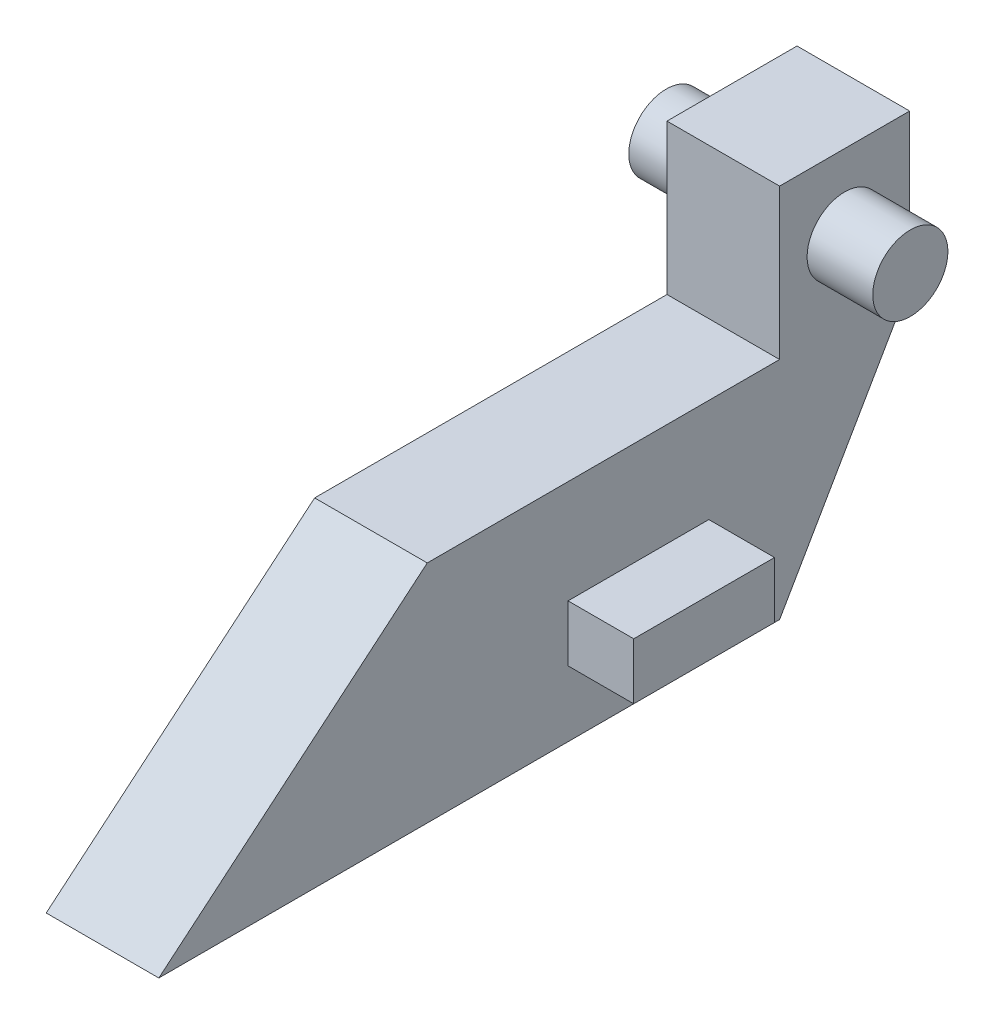
ISO-10303-21;
HEADER;
FILE_DESCRIPTION(('STEP AP214'),'2;1');
FILE_NAME('part.step','',(''),(''),'','','');
FILE_SCHEMA(('AUTOMOTIVE_DESIGN { 1 0 10303 214 1 1 1 1 }'));
ENDSEC;
DATA;
#1=APPLICATION_CONTEXT('core data for automotive mechanical design processes');
#2=APPLICATION_PROTOCOL_DEFINITION('international standard','automotive_design',2000,#1);
#3=PRODUCT_CONTEXT('',#1,'mechanical');
#4=PRODUCT('Part','Part','',(#3));
#5=PRODUCT_RELATED_PRODUCT_CATEGORY('part','',(#4));
#6=PRODUCT_DEFINITION_FORMATION('','',#4);
#7=PRODUCT_DEFINITION_CONTEXT('part definition',#1,'design');
#8=PRODUCT_DEFINITION('design','',#6,#7);
#9=PRODUCT_DEFINITION_SHAPE('','',#8);
#10=(LENGTH_UNIT() NAMED_UNIT(*) SI_UNIT(.MILLI.,.METRE.));
#11=(NAMED_UNIT(*) PLANE_ANGLE_UNIT() SI_UNIT($,.RADIAN.));
#12=(NAMED_UNIT(*) SI_UNIT($,.STERADIAN.) SOLID_ANGLE_UNIT());
#13=UNCERTAINTY_MEASURE_WITH_UNIT(LENGTH_MEASURE(1.E-05),#10,'distance_accuracy_value','');
#14=(GEOMETRIC_REPRESENTATION_CONTEXT(3) GLOBAL_UNCERTAINTY_ASSIGNED_CONTEXT((#13)) GLOBAL_UNIT_ASSIGNED_CONTEXT((#10,
#11,#12)) REPRESENTATION_CONTEXT('',''));
#15=CARTESIAN_POINT('',(0.,0.,0.));
#16=DIRECTION('',(0.,0.,1.));
#17=DIRECTION('',(1.,0.,0.));
#18=AXIS2_PLACEMENT_3D('',#15,#16,#17);
#19=CARTESIAN_POINT('',(6.,24.,-80.));
#20=DIRECTION('',(1.,0.,0.));
#21=DIRECTION('',(0.,1.,0.));
#22=AXIS2_PLACEMENT_3D('',#19,#20,#21);
#23=PLANE('',#22);
#24=CARTESIAN_POINT('',(6.,32.,-73.0717967697245));
#25=DIRECTION('',(1.,0.,0.));
#26=DIRECTION('',(0.,1.,0.));
#27=AXIS2_PLACEMENT_3D('',#24,#25,#26);
#28=CIRCLE('',#27,4.00000000000001);
#29=CARTESIAN_POINT('',(6.,32.,-69.0717967697245));
#30=VERTEX_POINT('',#29);
#31=EDGE_CURVE('E273',#30,#30,#28,.F.);
#32=ORIENTED_EDGE('',*,*,#31,.T.);
#33=EDGE_LOOP('',(#32));
#34=FACE_BOUND('',#33,.T.);
#35=DIRECTION('',(0.,0.642787609686535,-0.766044443118982));
#36=VECTOR('',#35,1.);
#37=CARTESIAN_POINT('',(6.,0.,0.));
#38=LINE('',#37,#36);
#39=CARTESIAN_POINT('',(6.,0.,0.));
#40=VERTEX_POINT('',#39);
#41=CARTESIAN_POINT('',(6.,24.,-28.6020862222614));
#42=VERTEX_POINT('',#41);
#43=EDGE_CURVE('E235',#40,#42,#38,.T.);
#44=ORIENTED_EDGE('',*,*,#43,.F.);
#45=DIRECTION('',(0.,0.,1.));
#46=VECTOR('',#45,1.);
#47=CARTESIAN_POINT('',(6.,0.,-80.));
#48=LINE('',#47,#46);
#49=CARTESIAN_POINT('',(6.,0.,-66.1435935394491));
#50=VERTEX_POINT('',#49);
#51=EDGE_CURVE('E256',#50,#40,#48,.T.);
#52=ORIENTED_EDGE('',*,*,#51,.F.);
#53=DIRECTION('',(0.,-0.86602540378444,0.499999999999998));
#54=VECTOR('',#53,1.);
#55=CARTESIAN_POINT('',(6.,-28.6410161513775,-49.6076951545869));
#56=LINE('',#55,#54);
#57=CARTESIAN_POINT('',(6.,24.,-80.));
#58=VERTEX_POINT('',#57);
#59=EDGE_CURVE('E234',#58,#50,#56,.T.);
#60=ORIENTED_EDGE('',*,*,#59,.F.);
#61=DIRECTION('',(0.,-1.,0.));
#62=VECTOR('',#61,1.);
#63=CARTESIAN_POINT('',(6.,40.,-80.));
#64=LINE('',#63,#62);
#65=CARTESIAN_POINT('',(6.,40.,-80.));
#66=VERTEX_POINT('',#65);
#67=EDGE_CURVE('E173',#66,#58,#64,.T.);
#68=ORIENTED_EDGE('',*,*,#67,.F.);
#69=DIRECTION('',(0.,0.,-1.));
#70=VECTOR('',#69,1.);
#71=CARTESIAN_POINT('',(6.,40.,-80.));
#72=LINE('',#71,#70);
#73=CARTESIAN_POINT('',(6.,40.,-66.1435935394491));
#74=VERTEX_POINT('',#73);
#75=EDGE_CURVE('E158',#74,#66,#72,.T.);
#76=ORIENTED_EDGE('',*,*,#75,.F.);
#77=DIRECTION('',(0.,-1.,0.));
#78=VECTOR('',#77,1.);
#79=CARTESIAN_POINT('',(6.,40.,-66.1435935394491));
#80=LINE('',#79,#78);
#81=CARTESIAN_POINT('',(6.,24.,-66.1435935394491));
#82=VERTEX_POINT('',#81);
#83=EDGE_CURVE('E155',#74,#82,#80,.T.);
#84=ORIENTED_EDGE('',*,*,#83,.T.);
#85=DIRECTION('',(0.,0.,1.));
#86=VECTOR('',#85,1.);
#87=CARTESIAN_POINT('',(6.,24.,-80.));
#88=LINE('',#87,#86);
#89=EDGE_CURVE('E50',#82,#42,#88,.T.);
#90=ORIENTED_EDGE('',*,*,#89,.T.);
#91=EDGE_LOOP('',(#44,#52,#60,#68,#76,#84,#90));
#92=FACE_BOUND('',#91,.T.);
#93=DIRECTION('',(0.,0.,-1.));
#94=VECTOR('',#93,1.);
#95=CARTESIAN_POINT('',(6.,7.,-43.6020862222614));
#96=LINE('',#95,#94);
#97=CARTESIAN_POINT('',(6.,7.,-43.6020862222614));
#98=VERTEX_POINT('',#97);
#99=CARTESIAN_POINT('',(6.,7.,-58.6020862222614));
#100=VERTEX_POINT('',#99);
#101=EDGE_CURVE('E219',#98,#100,#96,.T.);
#102=ORIENTED_EDGE('',*,*,#101,.F.);
#103=DIRECTION('',(0.,-1.,0.));
#104=VECTOR('',#103,1.);
#105=CARTESIAN_POINT('',(6.,13.,-43.6020862222614));
#106=LINE('',#105,#104);
#107=CARTESIAN_POINT('',(6.,13.,-43.6020862222614));
#108=VERTEX_POINT('',#107);
#109=EDGE_CURVE('E205',#108,#98,#106,.T.);
#110=ORIENTED_EDGE('',*,*,#109,.F.);
#111=DIRECTION('',(0.,0.,1.));
#112=VECTOR('',#111,1.);
#113=CARTESIAN_POINT('',(6.,13.,-43.6020862222614));
#114=LINE('',#113,#112);
#115=CARTESIAN_POINT('',(6.,13.,-58.6020862222614));
#116=VERTEX_POINT('',#115);
#117=EDGE_CURVE('E210',#116,#108,#114,.T.);
#118=ORIENTED_EDGE('',*,*,#117,.F.);
#119=DIRECTION('',(0.,1.,0.));
#120=VECTOR('',#119,1.);
#121=CARTESIAN_POINT('',(6.,13.,-58.6020862222614));
#122=LINE('',#121,#120);
#123=EDGE_CURVE('E221',#100,#116,#122,.T.);
#124=ORIENTED_EDGE('',*,*,#123,.F.);
#125=EDGE_LOOP('',(#102,#110,#118,#124));
#126=FACE_BOUND('',#125,.T.);
#127=ADVANCED_FACE('F41',(#34,#92,#126),#23,.T.);
#128=CARTESIAN_POINT('',(-6.,24.,-80.));
#129=DIRECTION('',(-1.,0.,0.));
#130=DIRECTION('',(0.,-1.,0.));
#131=AXIS2_PLACEMENT_3D('',#128,#129,#130);
#132=PLANE('',#131);
#133=CARTESIAN_POINT('',(-6.,32.,-73.0717967697245));
#134=DIRECTION('',(-1.,0.,0.));
#135=DIRECTION('',(0.,-1.,0.));
#136=AXIS2_PLACEMENT_3D('',#133,#134,#135);
#137=CIRCLE('',#136,4.00000000000001);
#138=CARTESIAN_POINT('',(-6.,32.,-69.0717967697245));
#139=VERTEX_POINT('',#138);
#140=EDGE_CURVE('E45',#139,#139,#137,.F.);
#141=ORIENTED_EDGE('',*,*,#140,.T.);
#142=EDGE_LOOP('',(#141));
#143=FACE_BOUND('',#142,.T.);
#144=DIRECTION('',(0.,-1.,0.));
#145=VECTOR('',#144,1.);
#146=CARTESIAN_POINT('',(-6.,13.,-43.6020862222614));
#147=LINE('',#146,#145);
#148=CARTESIAN_POINT('',(-6.,13.,-43.6020862222614));
#149=VERTEX_POINT('',#148);
#150=CARTESIAN_POINT('',(-6.,7.,-43.6020862222614));
#151=VERTEX_POINT('',#150);
#152=EDGE_CURVE('E170',#149,#151,#147,.T.);
#153=ORIENTED_EDGE('',*,*,#152,.T.);
#154=DIRECTION('',(0.,0.,-1.));
#155=VECTOR('',#154,1.);
#156=CARTESIAN_POINT('',(-6.,7.,-43.6020862222614));
#157=LINE('',#156,#155);
#158=CARTESIAN_POINT('',(-6.,7.,-58.6020862222614));
#159=VERTEX_POINT('',#158);
#160=EDGE_CURVE('E181',#151,#159,#157,.T.);
#161=ORIENTED_EDGE('',*,*,#160,.T.);
#162=DIRECTION('',(0.,1.,0.));
#163=VECTOR('',#162,1.);
#164=CARTESIAN_POINT('',(-6.,13.,-58.6020862222614));
#165=LINE('',#164,#163);
#166=CARTESIAN_POINT('',(-6.,13.,-58.6020862222614));
#167=VERTEX_POINT('',#166);
#168=EDGE_CURVE('E192',#159,#167,#165,.T.);
#169=ORIENTED_EDGE('',*,*,#168,.T.);
#170=DIRECTION('',(0.,0.,1.));
#171=VECTOR('',#170,1.);
#172=CARTESIAN_POINT('',(-6.,13.,-43.6020862222614));
#173=LINE('',#172,#171);
#174=EDGE_CURVE('E65',#167,#149,#173,.T.);
#175=ORIENTED_EDGE('',*,*,#174,.T.);
#176=EDGE_LOOP('',(#153,#161,#169,#175));
#177=FACE_BOUND('',#176,.T.);
#178=DIRECTION('',(0.,-0.642787609686535,0.766044443118982));
#179=VECTOR('',#178,1.);
#180=CARTESIAN_POINT('',(-6.00000000000001,49.308531988485,-58.7636201428241));
#181=LINE('',#180,#179);
#182=CARTESIAN_POINT('',(-6.00000000000002,24.,-28.6020862222614));
#183=VERTEX_POINT('',#182);
#184=CARTESIAN_POINT('',(-6.,0.,0.));
#185=VERTEX_POINT('',#184);
#186=EDGE_CURVE('E242',#183,#185,#181,.T.);
#187=ORIENTED_EDGE('',*,*,#186,.F.);
#188=DIRECTION('',(0.,0.,1.));
#189=VECTOR('',#188,1.);
#190=CARTESIAN_POINT('',(-6.,24.,-80.));
#191=LINE('',#190,#189);
#192=CARTESIAN_POINT('',(-6.,24.,-66.1435935394491));
#193=VERTEX_POINT('',#192);
#194=EDGE_CURVE('E11',#193,#183,#191,.T.);
#195=ORIENTED_EDGE('',*,*,#194,.F.);
#196=DIRECTION('',(0.,-1.,0.));
#197=VECTOR('',#196,1.);
#198=CARTESIAN_POINT('',(-6.,40.,-66.1435935394491));
#199=LINE('',#198,#197);
#200=CARTESIAN_POINT('',(-6.,40.,-66.1435935394491));
#201=VERTEX_POINT('',#200);
#202=EDGE_CURVE('E153',#201,#193,#199,.T.);
#203=ORIENTED_EDGE('',*,*,#202,.F.);
#204=DIRECTION('',(0.,0.,1.));
#205=VECTOR('',#204,1.);
#206=CARTESIAN_POINT('',(-6.,40.,-80.));
#207=LINE('',#206,#205);
#208=CARTESIAN_POINT('',(-6.,40.,-80.));
#209=VERTEX_POINT('',#208);
#210=EDGE_CURVE('E159',#209,#201,#207,.T.);
#211=ORIENTED_EDGE('',*,*,#210,.F.);
#212=DIRECTION('',(0.,-1.,0.));
#213=VECTOR('',#212,1.);
#214=CARTESIAN_POINT('',(-6.,40.,-80.));
#215=LINE('',#214,#213);
#216=CARTESIAN_POINT('',(-6.,24.,-80.));
#217=VERTEX_POINT('',#216);
#218=EDGE_CURVE('E280',#209,#217,#215,.T.);
#219=ORIENTED_EDGE('',*,*,#218,.T.);
#220=DIRECTION('',(0.,0.86602540378444,-0.499999999999998));
#221=VECTOR('',#220,1.);
#222=CARTESIAN_POINT('',(-6.,24.,-80.));
#223=LINE('',#222,#221);
#224=CARTESIAN_POINT('',(-6.00000000000001,0.,-66.1435935394491));
#225=VERTEX_POINT('',#224);
#226=EDGE_CURVE('E247',#225,#217,#223,.T.);
#227=ORIENTED_EDGE('',*,*,#226,.F.);
#228=DIRECTION('',(0.,0.,1.));
#229=VECTOR('',#228,1.);
#230=CARTESIAN_POINT('',(-6.,0.,-80.));
#231=LINE('',#230,#229);
#232=EDGE_CURVE('E253',#225,#185,#231,.T.);
#233=ORIENTED_EDGE('',*,*,#232,.T.);
#234=EDGE_LOOP('',(#187,#195,#203,#211,#219,#227,#233));
#235=FACE_BOUND('',#234,.T.);
#236=ADVANCED_FACE('F43',(#143,#177,#235),#132,.T.);
#237=CARTESIAN_POINT('',(-6.,24.,-80.));
#238=DIRECTION('',(0.,1.,0.));
#239=DIRECTION('',(0.,0.,1.));
#240=AXIS2_PLACEMENT_3D('',#237,#238,#239);
#241=PLANE('',#240);
#242=DIRECTION('',(1.,0.,0.));
#243=VECTOR('',#242,1.);
#244=CARTESIAN_POINT('',(-6.,24.,-66.1435935394491));
#245=LINE('',#244,#243);
#246=EDGE_CURVE('E57',#193,#82,#245,.T.);
#247=ORIENTED_EDGE('',*,*,#246,.F.);
#248=ORIENTED_EDGE('',*,*,#194,.T.);
#249=DIRECTION('',(1.,0.,0.));
#250=VECTOR('',#249,1.);
#251=CARTESIAN_POINT('',(-46.,24.,-28.6020862222614));
#252=LINE('',#251,#250);
#253=EDGE_CURVE('E238',#183,#42,#252,.T.);
#254=ORIENTED_EDGE('',*,*,#253,.T.);
#255=ORIENTED_EDGE('',*,*,#89,.F.);
#256=EDGE_LOOP('',(#247,#248,#254,#255));
#257=FACE_BOUND('',#256,.T.);
#258=ADVANCED_FACE('F272',(#257),#241,.T.);
#259=CARTESIAN_POINT('',(-6.,0.,-80.));
#260=DIRECTION('',(0.,-1.,0.));
#261=DIRECTION('',(0.,0.,-1.));
#262=AXIS2_PLACEMENT_3D('',#259,#260,#261);
#263=PLANE('',#262);
#264=DIRECTION('',(1.,0.,0.));
#265=VECTOR('',#264,1.);
#266=CARTESIAN_POINT('',(-46.,0.,-66.1435935394491));
#267=LINE('',#266,#265);
#268=EDGE_CURVE('E239',#225,#50,#267,.T.);
#269=ORIENTED_EDGE('',*,*,#268,.T.);
#270=ORIENTED_EDGE('',*,*,#51,.T.);
#271=DIRECTION('',(1.,0.,0.));
#272=VECTOR('',#271,1.);
#273=CARTESIAN_POINT('',(-6.,0.,0.));
#274=LINE('',#273,#272);
#275=EDGE_CURVE('E249',#185,#40,#274,.T.);
#276=ORIENTED_EDGE('',*,*,#275,.F.);
#277=ORIENTED_EDGE('',*,*,#232,.F.);
#278=EDGE_LOOP('',(#269,#270,#276,#277));
#279=FACE_BOUND('',#278,.T.);
#280=ADVANCED_FACE('F263',(#279),#263,.T.);
#281=CARTESIAN_POINT('',(-46.,0.,0.));
#282=DIRECTION('',(0.,-0.766044443118982,-0.642787609686535));
#283=DIRECTION('',(0.,0.642787609686535,-0.766044443118982));
#284=AXIS2_PLACEMENT_3D('',#281,#282,#283);
#285=PLANE('',#284);
#286=ORIENTED_EDGE('',*,*,#186,.T.);
#287=ORIENTED_EDGE('',*,*,#275,.T.);
#288=ORIENTED_EDGE('',*,*,#43,.T.);
#289=ORIENTED_EDGE('',*,*,#253,.F.);
#290=EDGE_LOOP('',(#286,#287,#288,#289));
#291=FACE_BOUND('',#290,.T.);
#292=ADVANCED_FACE('F267',(#291),#285,.F.);
#293=CARTESIAN_POINT('',(-46.,-28.6410161513775,-49.6076951545869));
#294=DIRECTION('',(0.,0.499999999999998,0.86602540378444));
#295=DIRECTION('',(0.,-0.86602540378444,0.499999999999998));
#296=AXIS2_PLACEMENT_3D('',#293,#294,#295);
#297=PLANE('',#296);
#298=ORIENTED_EDGE('',*,*,#226,.T.);
#299=DIRECTION('',(-1.,0.,0.));
#300=VECTOR('',#299,1.);
#301=CARTESIAN_POINT('',(-6.,24.,-80.));
#302=LINE('',#301,#300);
#303=EDGE_CURVE('E250',#58,#217,#302,.T.);
#304=ORIENTED_EDGE('',*,*,#303,.F.);
#305=ORIENTED_EDGE('',*,*,#59,.T.);
#306=ORIENTED_EDGE('',*,*,#268,.F.);
#307=EDGE_LOOP('',(#298,#304,#305,#306));
#308=FACE_BOUND('',#307,.T.);
#309=ADVANCED_FACE('F286',(#308),#297,.F.);
#310=CARTESIAN_POINT('',(13.,13.,-43.6020862222614));
#311=DIRECTION('',(0.,0.,-1.));
#312=DIRECTION('',(-1.,0.,0.));
#313=AXIS2_PLACEMENT_3D('',#310,#311,#312);
#314=PLANE('',#313);
#315=ORIENTED_EDGE('',*,*,#109,.T.);
#316=DIRECTION('',(-1.,0.,0.));
#317=VECTOR('',#316,1.);
#318=CARTESIAN_POINT('',(13.,7.,-43.6020862222614));
#319=LINE('',#318,#317);
#320=CARTESIAN_POINT('',(13.,7.,-43.6020862222614));
#321=VERTEX_POINT('',#320);
#322=EDGE_CURVE('E232',#321,#98,#319,.T.);
#323=ORIENTED_EDGE('',*,*,#322,.F.);
#324=DIRECTION('',(0.,-1.,0.));
#325=VECTOR('',#324,1.);
#326=CARTESIAN_POINT('',(13.,13.,-43.6020862222614));
#327=LINE('',#326,#325);
#328=CARTESIAN_POINT('',(13.,13.,-43.6020862222614));
#329=VERTEX_POINT('',#328);
#330=EDGE_CURVE('E206',#329,#321,#327,.T.);
#331=ORIENTED_EDGE('',*,*,#330,.F.);
#332=DIRECTION('',(-1.,0.,0.));
#333=VECTOR('',#332,1.);
#334=CARTESIAN_POINT('',(13.,13.,-43.6020862222614));
#335=LINE('',#334,#333);
#336=EDGE_CURVE('E216',#329,#108,#335,.T.);
#337=ORIENTED_EDGE('',*,*,#336,.T.);
#338=EDGE_LOOP('',(#315,#323,#331,#337));
#339=FACE_BOUND('',#338,.T.);
#340=ADVANCED_FACE('F288',(#339),#314,.F.);
#341=CARTESIAN_POINT('',(13.,7.,-43.6020862222614));
#342=DIRECTION('',(0.,1.,0.));
#343=DIRECTION('',(-1.,0.,0.));
#344=AXIS2_PLACEMENT_3D('',#341,#342,#343);
#345=PLANE('',#344);
#346=ORIENTED_EDGE('',*,*,#101,.T.);
#347=DIRECTION('',(-1.,0.,0.));
#348=VECTOR('',#347,1.);
#349=CARTESIAN_POINT('',(13.,7.,-58.6020862222614));
#350=LINE('',#349,#348);
#351=CARTESIAN_POINT('',(13.,7.,-58.6020862222614));
#352=VERTEX_POINT('',#351);
#353=EDGE_CURVE('E229',#352,#100,#350,.T.);
#354=ORIENTED_EDGE('',*,*,#353,.F.);
#355=DIRECTION('',(0.,0.,-1.));
#356=VECTOR('',#355,1.);
#357=CARTESIAN_POINT('',(13.,7.,-43.6020862222614));
#358=LINE('',#357,#356);
#359=EDGE_CURVE('E209',#321,#352,#358,.T.);
#360=ORIENTED_EDGE('',*,*,#359,.F.);
#361=ORIENTED_EDGE('',*,*,#322,.T.);
#362=EDGE_LOOP('',(#346,#354,#360,#361));
#363=FACE_BOUND('',#362,.T.);
#364=ADVANCED_FACE('F295',(#363),#345,.F.);
#365=CARTESIAN_POINT('',(13.,13.,-58.6020862222614));
#366=DIRECTION('',(0.,0.,1.));
#367=DIRECTION('',(1.,0.,0.));
#368=AXIS2_PLACEMENT_3D('',#365,#366,#367);
#369=PLANE('',#368);
#370=ORIENTED_EDGE('',*,*,#123,.T.);
#371=DIRECTION('',(-1.,0.,0.));
#372=VECTOR('',#371,1.);
#373=CARTESIAN_POINT('',(13.,13.,-58.6020862222614));
#374=LINE('',#373,#372);
#375=CARTESIAN_POINT('',(13.,13.,-58.6020862222614));
#376=VERTEX_POINT('',#375);
#377=EDGE_CURVE('E227',#376,#116,#374,.T.);
#378=ORIENTED_EDGE('',*,*,#377,.F.);
#379=DIRECTION('',(0.,1.,0.));
#380=VECTOR('',#379,1.);
#381=CARTESIAN_POINT('',(13.,13.,-58.6020862222614));
#382=LINE('',#381,#380);
#383=EDGE_CURVE('E212',#352,#376,#382,.T.);
#384=ORIENTED_EDGE('',*,*,#383,.F.);
#385=ORIENTED_EDGE('',*,*,#353,.T.);
#386=EDGE_LOOP('',(#370,#378,#384,#385));
#387=FACE_BOUND('',#386,.T.);
#388=ADVANCED_FACE('F377',(#387),#369,.F.);
#389=CARTESIAN_POINT('',(13.,13.,-43.6020862222614));
#390=DIRECTION('',(0.,-1.,0.));
#391=DIRECTION('',(1.,0.,0.));
#392=AXIS2_PLACEMENT_3D('',#389,#390,#391);
#393=PLANE('',#392);
#394=ORIENTED_EDGE('',*,*,#117,.T.);
#395=ORIENTED_EDGE('',*,*,#336,.F.);
#396=DIRECTION('',(0.,0.,1.));
#397=VECTOR('',#396,1.);
#398=CARTESIAN_POINT('',(13.,13.,-43.6020862222614));
#399=LINE('',#398,#397);
#400=EDGE_CURVE('E214',#376,#329,#399,.T.);
#401=ORIENTED_EDGE('',*,*,#400,.F.);
#402=ORIENTED_EDGE('',*,*,#377,.T.);
#403=EDGE_LOOP('',(#394,#395,#401,#402));
#404=FACE_BOUND('',#403,.T.);
#405=ADVANCED_FACE('F368',(#404),#393,.F.);
#406=CARTESIAN_POINT('',(13.,0.,0.));
#407=DIRECTION('',(1.,0.,0.));
#408=DIRECTION('',(0.,1.,0.));
#409=AXIS2_PLACEMENT_3D('',#406,#407,#408);
#410=PLANE('',#409);
#411=ORIENTED_EDGE('',*,*,#330,.T.);
#412=ORIENTED_EDGE('',*,*,#359,.T.);
#413=ORIENTED_EDGE('',*,*,#383,.T.);
#414=ORIENTED_EDGE('',*,*,#400,.T.);
#415=EDGE_LOOP('',(#411,#412,#413,#414));
#416=FACE_BOUND('',#415,.T.);
#417=ADVANCED_FACE('F359',(#416),#410,.T.);
#418=CARTESIAN_POINT('',(-13.,13.,-43.6020862222614));
#419=DIRECTION('',(0.,0.,1.));
#420=DIRECTION('',(1.,0.,0.));
#421=AXIS2_PLACEMENT_3D('',#418,#419,#420);
#422=PLANE('',#421);
#423=ORIENTED_EDGE('',*,*,#152,.F.);
#424=DIRECTION('',(1.,0.,0.));
#425=VECTOR('',#424,1.);
#426=CARTESIAN_POINT('',(-13.,13.,-43.6020862222614));
#427=LINE('',#426,#425);
#428=CARTESIAN_POINT('',(-13.,13.,-43.6020862222614));
#429=VERTEX_POINT('',#428);
#430=EDGE_CURVE('E203',#429,#149,#427,.T.);
#431=ORIENTED_EDGE('',*,*,#430,.F.);
#432=DIRECTION('',(0.,-1.,0.));
#433=VECTOR('',#432,1.);
#434=CARTESIAN_POINT('',(-13.,13.,-43.6020862222614));
#435=LINE('',#434,#433);
#436=CARTESIAN_POINT('',(-13.,7.,-43.6020862222614));
#437=VERTEX_POINT('',#436);
#438=EDGE_CURVE('E177',#429,#437,#435,.T.);
#439=ORIENTED_EDGE('',*,*,#438,.T.);
#440=DIRECTION('',(1.,0.,0.));
#441=VECTOR('',#440,1.);
#442=CARTESIAN_POINT('',(-13.,7.,-43.6020862222614));
#443=LINE('',#442,#441);
#444=EDGE_CURVE('E189',#437,#151,#443,.T.);
#445=ORIENTED_EDGE('',*,*,#444,.T.);
#446=EDGE_LOOP('',(#423,#431,#439,#445));
#447=FACE_BOUND('',#446,.T.);
#448=ADVANCED_FACE('F350',(#447),#422,.T.);
#449=CARTESIAN_POINT('',(-13.,13.,-43.6020862222614));
#450=DIRECTION('',(0.,1.,0.));
#451=DIRECTION('',(-1.,0.,0.));
#452=AXIS2_PLACEMENT_3D('',#449,#450,#451);
#453=PLANE('',#452);
#454=ORIENTED_EDGE('',*,*,#174,.F.);
#455=DIRECTION('',(1.,0.,0.));
#456=VECTOR('',#455,1.);
#457=CARTESIAN_POINT('',(-13.,13.,-58.6020862222614));
#458=LINE('',#457,#456);
#459=CARTESIAN_POINT('',(-13.,13.,-58.6020862222614));
#460=VERTEX_POINT('',#459);
#461=EDGE_CURVE('E200',#460,#167,#458,.T.);
#462=ORIENTED_EDGE('',*,*,#461,.F.);
#463=DIRECTION('',(0.,0.,1.));
#464=VECTOR('',#463,1.);
#465=CARTESIAN_POINT('',(-13.,13.,-43.6020862222614));
#466=LINE('',#465,#464);
#467=EDGE_CURVE('E180',#460,#429,#466,.T.);
#468=ORIENTED_EDGE('',*,*,#467,.T.);
#469=ORIENTED_EDGE('',*,*,#430,.T.);
#470=EDGE_LOOP('',(#454,#462,#468,#469));
#471=FACE_BOUND('',#470,.T.);
#472=ADVANCED_FACE('F341',(#471),#453,.T.);
#473=CARTESIAN_POINT('',(-13.,13.,-58.6020862222614));
#474=DIRECTION('',(0.,0.,-1.));
#475=DIRECTION('',(-1.,0.,0.));
#476=AXIS2_PLACEMENT_3D('',#473,#474,#475);
#477=PLANE('',#476);
#478=ORIENTED_EDGE('',*,*,#168,.F.);
#479=DIRECTION('',(1.,0.,0.));
#480=VECTOR('',#479,1.);
#481=CARTESIAN_POINT('',(-13.,7.,-58.6020862222614));
#482=LINE('',#481,#480);
#483=CARTESIAN_POINT('',(-13.,7.,-58.6020862222614));
#484=VERTEX_POINT('',#483);
#485=EDGE_CURVE('E197',#484,#159,#482,.T.);
#486=ORIENTED_EDGE('',*,*,#485,.F.);
#487=DIRECTION('',(0.,1.,0.));
#488=VECTOR('',#487,1.);
#489=CARTESIAN_POINT('',(-13.,13.,-58.6020862222614));
#490=LINE('',#489,#488);
#491=EDGE_CURVE('E184',#484,#460,#490,.T.);
#492=ORIENTED_EDGE('',*,*,#491,.T.);
#493=ORIENTED_EDGE('',*,*,#461,.T.);
#494=EDGE_LOOP('',(#478,#486,#492,#493));
#495=FACE_BOUND('',#494,.T.);
#496=ADVANCED_FACE('F332',(#495),#477,.T.);
#497=CARTESIAN_POINT('',(-13.,7.,-43.6020862222614));
#498=DIRECTION('',(0.,-1.,0.));
#499=DIRECTION('',(1.,0.,0.));
#500=AXIS2_PLACEMENT_3D('',#497,#498,#499);
#501=PLANE('',#500);
#502=ORIENTED_EDGE('',*,*,#160,.F.);
#503=ORIENTED_EDGE('',*,*,#444,.F.);
#504=DIRECTION('',(0.,0.,-1.));
#505=VECTOR('',#504,1.);
#506=CARTESIAN_POINT('',(-13.,7.,-43.6020862222614));
#507=LINE('',#506,#505);
#508=EDGE_CURVE('E187',#437,#484,#507,.T.);
#509=ORIENTED_EDGE('',*,*,#508,.T.);
#510=ORIENTED_EDGE('',*,*,#485,.T.);
#511=EDGE_LOOP('',(#502,#503,#509,#510));
#512=FACE_BOUND('',#511,.T.);
#513=ADVANCED_FACE('F323',(#512),#501,.T.);
#514=CARTESIAN_POINT('',(-13.,0.,0.));
#515=DIRECTION('',(-1.,0.,0.));
#516=DIRECTION('',(0.,1.,0.));
#517=AXIS2_PLACEMENT_3D('',#514,#515,#516);
#518=PLANE('',#517);
#519=ORIENTED_EDGE('',*,*,#438,.F.);
#520=ORIENTED_EDGE('',*,*,#467,.F.);
#521=ORIENTED_EDGE('',*,*,#491,.F.);
#522=ORIENTED_EDGE('',*,*,#508,.F.);
#523=EDGE_LOOP('',(#519,#520,#521,#522));
#524=FACE_BOUND('',#523,.T.);
#525=ADVANCED_FACE('F319',(#524),#518,.T.);
#526=CARTESIAN_POINT('',(-6.,40.,-66.1435935394491));
#527=DIRECTION('',(0.,0.,-1.));
#528=DIRECTION('',(-1.,0.,0.));
#529=AXIS2_PLACEMENT_3D('',#526,#527,#528);
#530=PLANE('',#529);
#531=ORIENTED_EDGE('',*,*,#246,.T.);
#532=ORIENTED_EDGE('',*,*,#83,.F.);
#533=DIRECTION('',(1.,0.,0.));
#534=VECTOR('',#533,1.);
#535=CARTESIAN_POINT('',(-6.,40.,-66.1435935394491));
#536=LINE('',#535,#534);
#537=EDGE_CURVE('E149',#201,#74,#536,.T.);
#538=ORIENTED_EDGE('',*,*,#537,.F.);
#539=ORIENTED_EDGE('',*,*,#202,.T.);
#540=EDGE_LOOP('',(#531,#532,#538,#539));
#541=FACE_BOUND('',#540,.T.);
#542=ADVANCED_FACE('F151',(#541),#530,.F.);
#543=CARTESIAN_POINT('',(-6.,40.,-80.));
#544=DIRECTION('',(0.,0.,1.));
#545=DIRECTION('',(1.,0.,0.));
#546=AXIS2_PLACEMENT_3D('',#543,#544,#545);
#547=PLANE('',#546);
#548=ORIENTED_EDGE('',*,*,#303,.T.);
#549=ORIENTED_EDGE('',*,*,#218,.F.);
#550=DIRECTION('',(-1.,0.,0.));
#551=VECTOR('',#550,1.);
#552=CARTESIAN_POINT('',(-6.,40.,-80.));
#553=LINE('',#552,#551);
#554=EDGE_CURVE('E164',#66,#209,#553,.T.);
#555=ORIENTED_EDGE('',*,*,#554,.F.);
#556=ORIENTED_EDGE('',*,*,#67,.T.);
#557=EDGE_LOOP('',(#548,#549,#555,#556));
#558=FACE_BOUND('',#557,.T.);
#559=ADVANCED_FACE('F284',(#558),#547,.F.);
#560=CARTESIAN_POINT('',(0.,40.,0.));
#561=DIRECTION('',(0.,1.,0.));
#562=DIRECTION('',(0.,0.,1.));
#563=AXIS2_PLACEMENT_3D('',#560,#561,#562);
#564=PLANE('',#563);
#565=ORIENTED_EDGE('',*,*,#210,.T.);
#566=ORIENTED_EDGE('',*,*,#537,.T.);
#567=ORIENTED_EDGE('',*,*,#75,.T.);
#568=ORIENTED_EDGE('',*,*,#554,.T.);
#569=EDGE_LOOP('',(#565,#566,#567,#568));
#570=FACE_BOUND('',#569,.T.);
#571=ADVANCED_FACE('F162',(#570),#564,.T.);
#572=CARTESIAN_POINT('',(-13.,32.,-73.0717967697245));
#573=DIRECTION('',(1.,0.,0.));
#574=DIRECTION('',(0.,0.,-1.));
#575=AXIS2_PLACEMENT_3D('',#572,#573,#574);
#576=PLANE('',#575);
#577=CARTESIAN_POINT('',(-13.,32.,-73.0717967697245));
#578=DIRECTION('',(1.,0.,0.));
#579=DIRECTION('',(0.,0.,-1.));
#580=AXIS2_PLACEMENT_3D('',#577,#578,#579);
#581=CIRCLE('',#580,4.00000000000001);
#582=CARTESIAN_POINT('',(-13.,32.,-69.0717967697245));
#583=VERTEX_POINT('',#582);
#584=EDGE_CURVE('E505',#583,#583,#581,.T.);
#585=ORIENTED_EDGE('',*,*,#584,.F.);
#586=EDGE_LOOP('',(#585));
#587=FACE_BOUND('',#586,.T.);
#588=ADVANCED_FACE('F451',(#587),#576,.F.);
#589=CARTESIAN_POINT('',(13.,32.,-73.0717967697245));
#590=DIRECTION('',(-1.,0.,0.));
#591=DIRECTION('',(0.,0.,1.));
#592=AXIS2_PLACEMENT_3D('',#589,#590,#591);
#593=CYLINDRICAL_SURFACE('',#592,4.00000000000001);
#594=CARTESIAN_POINT('',(-6.,32.,-69.0717967697245));
#595=CARTESIAN_POINT('',(-6.07291666666667,32.,-69.0717967697245));
#596=CARTESIAN_POINT('',(-6.14583333333333,32.,-69.0717967697245));
#597=CARTESIAN_POINT('',(-6.29166666666667,32.,-69.0717967697245));
#598=CARTESIAN_POINT('',(-6.36458333333333,32.,-69.0717967697245));
#599=CARTESIAN_POINT('',(-6.51041666666667,32.,-69.0717967697245));
#600=CARTESIAN_POINT('',(-6.58333333333333,32.,-69.0717967697245));
#601=CARTESIAN_POINT('',(-6.72916666666667,32.,-69.0717967697245));
#602=CARTESIAN_POINT('',(-6.80208333333333,32.,-69.0717967697245));
#603=CARTESIAN_POINT('',(-6.94791666666667,32.,-69.0717967697245));
#604=CARTESIAN_POINT('',(-7.02083333333333,32.,-69.0717967697245));
#605=CARTESIAN_POINT('',(-7.16666666666667,32.,-69.0717967697245));
#606=CARTESIAN_POINT('',(-7.23958333333333,32.,-69.0717967697245));
#607=CARTESIAN_POINT('',(-7.38541666666667,32.,-69.0717967697245));
#608=CARTESIAN_POINT('',(-7.45833333333333,32.,-69.0717967697245));
#609=CARTESIAN_POINT('',(-7.60416666666667,32.,-69.0717967697245));
#610=CARTESIAN_POINT('',(-7.67708333333333,32.,-69.0717967697245));
#611=CARTESIAN_POINT('',(-7.82291666666667,32.,-69.0717967697245));
#612=CARTESIAN_POINT('',(-7.89583333333333,32.,-69.0717967697245));
#613=CARTESIAN_POINT('',(-8.04166666666667,32.,-69.0717967697245));
#614=CARTESIAN_POINT('',(-8.11458333333333,32.,-69.0717967697245));
#615=CARTESIAN_POINT('',(-8.26041666666667,32.,-69.0717967697245));
#616=CARTESIAN_POINT('',(-8.33333333333333,32.,-69.0717967697245));
#617=CARTESIAN_POINT('',(-8.47916666666667,32.,-69.0717967697245));
#618=CARTESIAN_POINT('',(-8.55208333333333,32.,-69.0717967697245));
#619=CARTESIAN_POINT('',(-8.69791666666667,32.,-69.0717967697245));
#620=CARTESIAN_POINT('',(-8.77083333333333,32.,-69.0717967697245));
#621=CARTESIAN_POINT('',(-8.91666666666667,32.,-69.0717967697245));
#622=CARTESIAN_POINT('',(-8.98958333333333,32.,-69.0717967697245));
#623=CARTESIAN_POINT('',(-9.13541666666667,32.,-69.0717967697245));
#624=CARTESIAN_POINT('',(-9.20833333333333,32.,-69.0717967697245));
#625=CARTESIAN_POINT('',(-9.35416666666667,32.,-69.0717967697245));
#626=CARTESIAN_POINT('',(-9.42708333333333,32.,-69.0717967697245));
#627=CARTESIAN_POINT('',(-9.57291666666667,32.,-69.0717967697245));
#628=CARTESIAN_POINT('',(-9.64583333333333,32.,-69.0717967697245));
#629=CARTESIAN_POINT('',(-9.79166666666667,32.,-69.0717967697245));
#630=CARTESIAN_POINT('',(-9.86458333333333,32.,-69.0717967697245));
#631=CARTESIAN_POINT('',(-10.0104166666667,32.,-69.0717967697245));
#632=CARTESIAN_POINT('',(-10.0833333333333,32.,-69.0717967697245));
#633=CARTESIAN_POINT('',(-10.2291666666667,32.,-69.0717967697245));
#634=CARTESIAN_POINT('',(-10.3020833333333,32.,-69.0717967697245));
#635=CARTESIAN_POINT('',(-10.4479166666667,32.,-69.0717967697245));
#636=CARTESIAN_POINT('',(-10.5208333333333,32.,-69.0717967697245));
#637=CARTESIAN_POINT('',(-10.6666666666667,32.,-69.0717967697245));
#638=CARTESIAN_POINT('',(-10.7395833333333,32.,-69.0717967697245));
#639=CARTESIAN_POINT('',(-10.8854166666667,32.,-69.0717967697245));
#640=CARTESIAN_POINT('',(-10.9583333333333,32.,-69.0717967697245));
#641=CARTESIAN_POINT('',(-11.1041666666667,32.,-69.0717967697245));
#642=CARTESIAN_POINT('',(-11.1770833333333,32.,-69.0717967697245));
#643=CARTESIAN_POINT('',(-11.3229166666667,32.,-69.0717967697245));
#644=CARTESIAN_POINT('',(-11.3958333333333,32.,-69.0717967697245));
#645=CARTESIAN_POINT('',(-11.5416666666667,32.,-69.0717967697245));
#646=CARTESIAN_POINT('',(-11.6145833333333,32.,-69.0717967697245));
#647=CARTESIAN_POINT('',(-11.7604166666667,32.,-69.0717967697245));
#648=CARTESIAN_POINT('',(-11.8333333333333,32.,-69.0717967697245));
#649=CARTESIAN_POINT('',(-11.9791666666667,32.,-69.0717967697245));
#650=CARTESIAN_POINT('',(-12.0520833333333,32.,-69.0717967697245));
#651=CARTESIAN_POINT('',(-12.1979166666667,32.,-69.0717967697245));
#652=CARTESIAN_POINT('',(-12.2708333333333,32.,-69.0717967697245));
#653=CARTESIAN_POINT('',(-12.4166666666667,32.,-69.0717967697245));
#654=CARTESIAN_POINT('',(-12.4895833333333,32.,-69.0717967697245));
#655=CARTESIAN_POINT('',(-12.6354166666667,32.,-69.0717967697245));
#656=CARTESIAN_POINT('',(-12.7083333333333,32.,-69.0717967697245));
#657=CARTESIAN_POINT('',(-12.8541666666667,32.,-69.0717967697245));
#658=CARTESIAN_POINT('',(-12.9270833333333,32.,-69.0717967697245));
#659=CARTESIAN_POINT('',(-13.,32.,-69.0717967697245));
#660=B_SPLINE_CURVE_WITH_KNOTS('',3,(#594,#595,#596,#597,#598,#599,#600,#601,#602,#603,#604,
#605,#606,#607,#608,#609,#610,#611,#612,#613,#614,#615,#616,#617,#618,#619,#620,#621,#622,#623,
#624,#625,#626,#627,#628,#629,#630,#631,#632,#633,#634,#635,#636,#637,#638,#639,#640,#641,#642,
#643,#644,#645,#646,#647,#648,#649,#650,#651,#652,#653,#654,#655,#656,#657,#658,#659),
.UNSPECIFIED.,.F.,.F.,(4,2,2,2,2,2,2,2,2,2,2,2,2,2,2,2,2,2,2,2,2,2,2,2,2,2,2,2,2,2,2,2,4),(0.,
0.21875,0.4375,0.656250000000001,0.875000000000001,1.09375,1.3125,1.53125,1.75,1.96875,2.1875,
2.40625,2.625,2.84375,3.0625,3.28125,3.5,3.71875,3.9375,4.15625,4.375,4.59375,4.8125,5.03125,
5.25,5.46875,5.6875,5.90625,6.125,6.34375,6.5625,6.78125,7.),.UNSPECIFIED.);
#661=EDGE_CURVE('BSEAM459',#139,#583,#660,.T.);
#662=ORIENTED_EDGE('',*,*,#140,.F.);
#663=ORIENTED_EDGE('',*,*,#584,.T.);
#664=ORIENTED_EDGE('',*,*,#661,.T.);
#665=ORIENTED_EDGE('',*,*,#661,.F.);
#666=EDGE_LOOP('',(#662,#664,#663,#665));
#667=FACE_BOUND('',#666,.T.);
#668=ADVANCED_FACE('F459',(#667),#593,.T.);
#669=CARTESIAN_POINT('',(13.,32.,-73.0717967697245));
#670=DIRECTION('',(1.,0.,0.));
#671=DIRECTION('',(0.,0.,-1.));
#672=AXIS2_PLACEMENT_3D('',#669,#670,#671);
#673=CIRCLE('',#672,4.00000000000001);
#674=CARTESIAN_POINT('',(13.,32.,-69.0717967697245));
#675=VERTEX_POINT('',#674);
#676=EDGE_CURVE('E503',#675,#675,#673,.T.);
#677=CARTESIAN_POINT('',(6.,32.,-69.0717967697245));
#678=CARTESIAN_POINT('',(6.07291666666667,32.,-69.0717967697245));
#679=CARTESIAN_POINT('',(6.14583333333334,32.,-69.0717967697245));
#680=CARTESIAN_POINT('',(6.29166666666667,32.,-69.0717967697245));
#681=CARTESIAN_POINT('',(6.36458333333334,32.,-69.0717967697245));
#682=CARTESIAN_POINT('',(6.51041666666667,32.,-69.0717967697245));
#683=CARTESIAN_POINT('',(6.58333333333334,32.,-69.0717967697245));
#684=CARTESIAN_POINT('',(6.72916666666667,32.,-69.0717967697245));
#685=CARTESIAN_POINT('',(6.80208333333334,32.,-69.0717967697245));
#686=CARTESIAN_POINT('',(6.94791666666667,32.,-69.0717967697245));
#687=CARTESIAN_POINT('',(7.02083333333334,32.,-69.0717967697245));
#688=CARTESIAN_POINT('',(7.16666666666667,32.,-69.0717967697245));
#689=CARTESIAN_POINT('',(7.23958333333334,32.,-69.0717967697245));
#690=CARTESIAN_POINT('',(7.38541666666667,32.,-69.0717967697245));
#691=CARTESIAN_POINT('',(7.45833333333334,32.,-69.0717967697245));
#692=CARTESIAN_POINT('',(7.60416666666667,32.,-69.0717967697245));
#693=CARTESIAN_POINT('',(7.67708333333334,32.,-69.0717967697245));
#694=CARTESIAN_POINT('',(7.82291666666667,32.,-69.0717967697245));
#695=CARTESIAN_POINT('',(7.89583333333334,32.,-69.0717967697245));
#696=CARTESIAN_POINT('',(8.04166666666667,32.,-69.0717967697245));
#697=CARTESIAN_POINT('',(8.11458333333334,32.,-69.0717967697245));
#698=CARTESIAN_POINT('',(8.26041666666667,32.,-69.0717967697245));
#699=CARTESIAN_POINT('',(8.33333333333334,32.,-69.0717967697245));
#700=CARTESIAN_POINT('',(8.47916666666667,32.,-69.0717967697245));
#701=CARTESIAN_POINT('',(8.55208333333334,32.,-69.0717967697245));
#702=CARTESIAN_POINT('',(8.69791666666667,32.,-69.0717967697245));
#703=CARTESIAN_POINT('',(8.77083333333334,32.,-69.0717967697245));
#704=CARTESIAN_POINT('',(8.91666666666667,32.,-69.0717967697245));
#705=CARTESIAN_POINT('',(8.98958333333333,32.,-69.0717967697245));
#706=CARTESIAN_POINT('',(9.13541666666667,32.,-69.0717967697245));
#707=CARTESIAN_POINT('',(9.20833333333333,32.,-69.0717967697245));
#708=CARTESIAN_POINT('',(9.35416666666667,32.,-69.0717967697245));
#709=CARTESIAN_POINT('',(9.42708333333333,32.,-69.0717967697245));
#710=CARTESIAN_POINT('',(9.57291666666667,32.,-69.0717967697245));
#711=CARTESIAN_POINT('',(9.64583333333333,32.,-69.0717967697245));
#712=CARTESIAN_POINT('',(9.79166666666667,32.,-69.0717967697245));
#713=CARTESIAN_POINT('',(9.86458333333333,32.,-69.0717967697245));
#714=CARTESIAN_POINT('',(10.0104166666667,32.,-69.0717967697245));
#715=CARTESIAN_POINT('',(10.0833333333333,32.,-69.0717967697245));
#716=CARTESIAN_POINT('',(10.2291666666667,32.,-69.0717967697245));
#717=CARTESIAN_POINT('',(10.3020833333333,32.,-69.0717967697245));
#718=CARTESIAN_POINT('',(10.4479166666667,32.,-69.0717967697245));
#719=CARTESIAN_POINT('',(10.5208333333333,32.,-69.0717967697245));
#720=CARTESIAN_POINT('',(10.6666666666667,32.,-69.0717967697245));
#721=CARTESIAN_POINT('',(10.7395833333333,32.,-69.0717967697245));
#722=CARTESIAN_POINT('',(10.8854166666667,32.,-69.0717967697245));
#723=CARTESIAN_POINT('',(10.9583333333333,32.,-69.0717967697245));
#724=CARTESIAN_POINT('',(11.1041666666667,32.,-69.0717967697245));
#725=CARTESIAN_POINT('',(11.1770833333333,32.,-69.0717967697245));
#726=CARTESIAN_POINT('',(11.3229166666667,32.,-69.0717967697245));
#727=CARTESIAN_POINT('',(11.3958333333333,32.,-69.0717967697245));
#728=CARTESIAN_POINT('',(11.5416666666667,32.,-69.0717967697245));
#729=CARTESIAN_POINT('',(11.6145833333333,32.,-69.0717967697245));
#730=CARTESIAN_POINT('',(11.7604166666667,32.,-69.0717967697245));
#731=CARTESIAN_POINT('',(11.8333333333333,32.,-69.0717967697245));
#732=CARTESIAN_POINT('',(11.9791666666667,32.,-69.0717967697245));
#733=CARTESIAN_POINT('',(12.0520833333333,32.,-69.0717967697245));
#734=CARTESIAN_POINT('',(12.1979166666667,32.,-69.0717967697245));
#735=CARTESIAN_POINT('',(12.2708333333333,32.,-69.0717967697245));
#736=CARTESIAN_POINT('',(12.4166666666667,32.,-69.0717967697245));
#737=CARTESIAN_POINT('',(12.4895833333333,32.,-69.0717967697245));
#738=CARTESIAN_POINT('',(12.6354166666667,32.,-69.0717967697245));
#739=CARTESIAN_POINT('',(12.7083333333333,32.,-69.0717967697245));
#740=CARTESIAN_POINT('',(12.8541666666667,32.,-69.0717967697245));
#741=CARTESIAN_POINT('',(12.9270833333333,32.,-69.0717967697245));
#742=CARTESIAN_POINT('',(13.,32.,-69.0717967697245));
#743=B_SPLINE_CURVE_WITH_KNOTS('',3,(#677,#678,#679,#680,#681,#682,#683,#684,#685,#686,#687,
#688,#689,#690,#691,#692,#693,#694,#695,#696,#697,#698,#699,#700,#701,#702,#703,#704,#705,#706,
#707,#708,#709,#710,#711,#712,#713,#714,#715,#716,#717,#718,#719,#720,#721,#722,#723,#724,#725,
#726,#727,#728,#729,#730,#731,#732,#733,#734,#735,#736,#737,#738,#739,#740,#741,#742),
.UNSPECIFIED.,.F.,.F.,(4,2,2,2,2,2,2,2,2,2,2,2,2,2,2,2,2,2,2,2,2,2,2,2,2,2,2,2,2,2,2,2,4),(0.,
0.21875,0.4375,0.65625,0.874999999999999,1.09375,1.3125,1.53125,1.75,1.96875,2.1875,2.40625,
2.625,2.84375,3.0625,3.28125,3.5,3.71875,3.9375,4.15625,4.375,4.59375,4.8125,5.03125,5.25,
5.46875,5.6875,5.90625,6.125,6.34374999999999,6.56249999999999,6.78124999999999,
6.99999999999999),.UNSPECIFIED.);
#744=EDGE_CURVE('BSEAM468',#30,#675,#743,.T.);
#745=ORIENTED_EDGE('',*,*,#31,.F.);
#746=ORIENTED_EDGE('',*,*,#676,.F.);
#747=ORIENTED_EDGE('',*,*,#744,.T.);
#748=ORIENTED_EDGE('',*,*,#744,.F.);
#749=EDGE_LOOP('',(#745,#747,#746,#748));
#750=FACE_BOUND('',#749,.T.);
#751=ADVANCED_FACE('F468',(#750),#593,.T.);
#752=CARTESIAN_POINT('',(13.,32.,-73.0717967697245));
#753=DIRECTION('',(1.,0.,0.));
#754=DIRECTION('',(0.,0.,-1.));
#755=AXIS2_PLACEMENT_3D('',#752,#753,#754);
#756=PLANE('',#755);
#757=ORIENTED_EDGE('',*,*,#676,.T.);
#758=EDGE_LOOP('',(#757));
#759=FACE_BOUND('',#758,.T.);
#760=ADVANCED_FACE('F477',(#759),#756,.T.);
#761=CLOSED_SHELL('',(#127,#236,#258,#280,#292,#309,#340,#364,#388,#405,#417,#448,#472,#496,
#513,#525,#542,#559,#571,#588,#668,#751,#760));
#762=MANIFOLD_SOLID_BREP('B2',#761);
#763=ADVANCED_BREP_SHAPE_REPRESENTATION('',(#18,#762),#14);
#764=SHAPE_DEFINITION_REPRESENTATION(#9,#763);
ENDSEC;
END-ISO-10303-21;
